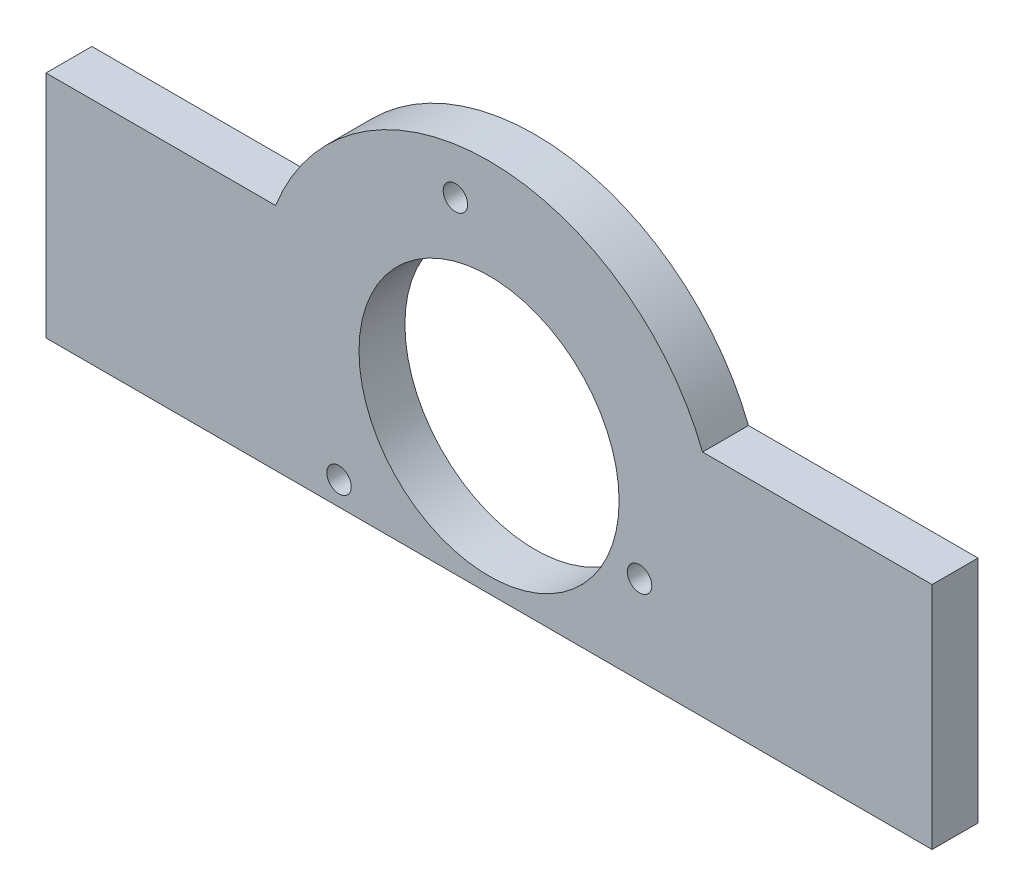
ISO-10303-21;
HEADER;
FILE_DESCRIPTION(('STEP AP214'),'2;1');
FILE_NAME('part.step','',(''),(''),'','','');
FILE_SCHEMA(('AUTOMOTIVE_DESIGN { 1 0 10303 214 1 1 1 1 }'));
ENDSEC;
DATA;
#1=APPLICATION_CONTEXT('core data for automotive mechanical design processes');
#2=APPLICATION_PROTOCOL_DEFINITION('international standard','automotive_design',2000,#1);
#3=PRODUCT_CONTEXT('',#1,'mechanical');
#4=PRODUCT('Part','Part','',(#3));
#5=PRODUCT_RELATED_PRODUCT_CATEGORY('part','',(#4));
#6=PRODUCT_DEFINITION_FORMATION('','',#4);
#7=PRODUCT_DEFINITION_CONTEXT('part definition',#1,'design');
#8=PRODUCT_DEFINITION('design','',#6,#7);
#9=PRODUCT_DEFINITION_SHAPE('','',#8);
#10=(LENGTH_UNIT() NAMED_UNIT(*) SI_UNIT(.MILLI.,.METRE.));
#11=(NAMED_UNIT(*) PLANE_ANGLE_UNIT() SI_UNIT($,.RADIAN.));
#12=(NAMED_UNIT(*) SI_UNIT($,.STERADIAN.) SOLID_ANGLE_UNIT());
#13=UNCERTAINTY_MEASURE_WITH_UNIT(LENGTH_MEASURE(1.E-05),#10,'distance_accuracy_value','');
#14=(GEOMETRIC_REPRESENTATION_CONTEXT(3) GLOBAL_UNCERTAINTY_ASSIGNED_CONTEXT((#13)) GLOBAL_UNIT_ASSIGNED_CONTEXT((#10,
#11,#12)) REPRESENTATION_CONTEXT('',''));
#15=CARTESIAN_POINT('',(0.,0.,0.));
#16=DIRECTION('',(0.,0.,1.));
#17=DIRECTION('',(1.,0.,0.));
#18=AXIS2_PLACEMENT_3D('',#15,#16,#17);
#19=CARTESIAN_POINT('',(0.,0.,7.62));
#20=DIRECTION('',(0.,0.,-1.));
#21=DIRECTION('',(-1.,0.,0.));
#22=AXIS2_PLACEMENT_3D('',#19,#20,#21);
#23=CYLINDRICAL_SURFACE('',#22,38.1);
#24=DIRECTION('',(0.,0.,-1.));
#25=VECTOR('',#24,1.);
#26=CARTESIAN_POINT('',(35.4464257718603,13.97,7.62));
#27=LINE('',#26,#25);
#28=CARTESIAN_POINT('',(35.4464257718603,13.97,7.62));
#29=VERTEX_POINT('',#28);
#30=CARTESIAN_POINT('',(35.4464257718603,13.97,0.));
#31=VERTEX_POINT('',#30);
#32=EDGE_CURVE('E50',#29,#31,#27,.T.);
#33=ORIENTED_EDGE('',*,*,#32,.T.);
#34=CARTESIAN_POINT('',(0.,0.,0.));
#35=DIRECTION('',(0.,0.,1.));
#36=DIRECTION('',(1.,0.,0.));
#37=AXIS2_PLACEMENT_3D('',#34,#35,#36);
#38=CIRCLE('',#37,38.1);
#39=CARTESIAN_POINT('',(-35.4464257718603,13.97,0.));
#40=VERTEX_POINT('',#39);
#41=EDGE_CURVE('E36',#31,#40,#38,.T.);
#42=ORIENTED_EDGE('',*,*,#41,.T.);
#43=DIRECTION('',(0.,0.,-1.));
#44=VECTOR('',#43,1.);
#45=CARTESIAN_POINT('',(-35.4464257718603,13.97,7.62));
#46=LINE('',#45,#44);
#47=CARTESIAN_POINT('',(-35.4464257718603,13.97,7.62));
#48=VERTEX_POINT('',#47);
#49=EDGE_CURVE('E130',#48,#40,#46,.T.);
#50=ORIENTED_EDGE('',*,*,#49,.F.);
#51=CARTESIAN_POINT('',(0.,0.,7.62));
#52=DIRECTION('',(0.,0.,1.));
#53=DIRECTION('',(1.,0.,0.));
#54=AXIS2_PLACEMENT_3D('',#51,#52,#53);
#55=CIRCLE('',#54,38.1);
#56=EDGE_CURVE('E11',#29,#48,#55,.T.);
#57=ORIENTED_EDGE('',*,*,#56,.F.);
#58=EDGE_LOOP('',(#33,#42,#50,#57));
#59=FACE_BOUND('',#58,.T.);
#60=ADVANCED_FACE('F33',(#59),#23,.T.);
#61=CARTESIAN_POINT('',(0.,0.,7.62));
#62=DIRECTION('',(0.,0.,1.));
#63=DIRECTION('',(1.,0.,0.));
#64=AXIS2_PLACEMENT_3D('',#61,#62,#63);
#65=PLANE('',#64);
#66=DIRECTION('',(-1.,0.,0.));
#67=VECTOR('',#66,1.);
#68=CARTESIAN_POINT('',(-36.2560555223226,-24.13,7.62));
#69=LINE('',#68,#67);
#70=CARTESIAN_POINT('',(73.5464257718603,-24.13,7.62));
#71=VERTEX_POINT('',#70);
#72=CARTESIAN_POINT('',(-73.5464257718603,-24.13,7.62));
#73=VERTEX_POINT('',#72);
#74=EDGE_CURVE('E81',#71,#73,#69,.T.);
#75=ORIENTED_EDGE('',*,*,#74,.F.);
#76=DIRECTION('',(0.,1.,0.));
#77=VECTOR('',#76,1.);
#78=CARTESIAN_POINT('',(73.5464257718603,0.,7.62));
#79=LINE('',#78,#77);
#80=CARTESIAN_POINT('',(73.5464257718603,13.97,7.62));
#81=VERTEX_POINT('',#80);
#82=EDGE_CURVE('E86',#71,#81,#79,.T.);
#83=ORIENTED_EDGE('',*,*,#82,.T.);
#84=DIRECTION('',(-1.,0.,0.));
#85=VECTOR('',#84,1.);
#86=CARTESIAN_POINT('',(0.,13.97,7.62));
#87=LINE('',#86,#85);
#88=EDGE_CURVE('E107',#81,#29,#87,.T.);
#89=ORIENTED_EDGE('',*,*,#88,.T.);
#90=ORIENTED_EDGE('',*,*,#56,.T.);
#91=DIRECTION('',(-1.,0.,0.));
#92=VECTOR('',#91,1.);
#93=CARTESIAN_POINT('',(0.,13.97,7.62));
#94=LINE('',#93,#92);
#95=CARTESIAN_POINT('',(-73.5464257718603,13.97,7.62));
#96=VERTEX_POINT('',#95);
#97=EDGE_CURVE('E118',#48,#96,#94,.T.);
#98=ORIENTED_EDGE('',*,*,#97,.T.);
#99=DIRECTION('',(0.,-1.,0.));
#100=VECTOR('',#99,1.);
#101=CARTESIAN_POINT('',(-73.5464257718603,0.,7.62));
#102=LINE('',#101,#100);
#103=EDGE_CURVE('E89',#96,#73,#102,.T.);
#104=ORIENTED_EDGE('',*,*,#103,.T.);
#105=EDGE_LOOP('',(#75,#83,#89,#90,#98,#104));
#106=FACE_BOUND('',#105,.T.);
#107=CARTESIAN_POINT('',(-24.9028298832855,-20.1910928657445,7.62));
#108=DIRECTION('',(0.,0.,1.));
#109=DIRECTION('',(1.,0.,0.));
#110=AXIS2_PLACEMENT_3D('',#107,#108,#109);
#111=CIRCLE('',#110,2.032);
#112=CARTESIAN_POINT('',(-22.8708298832855,-20.1910928657445,7.62));
#113=VERTEX_POINT('',#112);
#114=EDGE_CURVE('E136',#113,#113,#111,.T.);
#115=ORIENTED_EDGE('',*,*,#114,.F.);
#116=EDGE_LOOP('',(#115));
#117=FACE_BOUND('',#116,.T.);
#118=CARTESIAN_POINT('',(-5.58170556163229,30.0374071342555,7.62));
#119=DIRECTION('',(0.,0.,1.));
#120=DIRECTION('',(1.,0.,0.));
#121=AXIS2_PLACEMENT_3D('',#118,#119,#120);
#122=CIRCLE('',#121,2.032);
#123=CARTESIAN_POINT('',(-3.54970556163229,30.0374071342555,7.62));
#124=VERTEX_POINT('',#123);
#125=EDGE_CURVE('E142',#124,#124,#122,.T.);
#126=ORIENTED_EDGE('',*,*,#125,.F.);
#127=EDGE_LOOP('',(#126));
#128=FACE_BOUND('',#127,.T.);
#129=CARTESIAN_POINT('',(24.9827701167145,-9.48466626464084,7.62));
#130=DIRECTION('',(0.,0.,1.));
#131=DIRECTION('',(1.,0.,0.));
#132=AXIS2_PLACEMENT_3D('',#129,#130,#131);
#133=CIRCLE('',#132,2.032);
#134=CARTESIAN_POINT('',(27.0147701167145,-9.48466626464084,7.62));
#135=VERTEX_POINT('',#134);
#136=EDGE_CURVE('E133',#135,#135,#133,.T.);
#137=ORIENTED_EDGE('',*,*,#136,.F.);
#138=EDGE_LOOP('',(#137));
#139=FACE_BOUND('',#138,.T.);
#140=CARTESIAN_POINT('',(0.,0.,7.62));
#141=DIRECTION('',(0.,0.,1.));
#142=DIRECTION('',(1.,0.,0.));
#143=AXIS2_PLACEMENT_3D('',#140,#141,#142);
#144=CIRCLE('',#143,21.59);
#145=CARTESIAN_POINT('',(-21.59,0.,7.62));
#146=VERTEX_POINT('',#145);
#147=EDGE_CURVE('E152',#146,#146,#144,.T.);
#148=ORIENTED_EDGE('',*,*,#147,.F.);
#149=EDGE_LOOP('',(#148));
#150=FACE_BOUND('',#149,.T.);
#151=ADVANCED_FACE('F83',(#106,#117,#128,#139,#150),#65,.T.);
#152=CARTESIAN_POINT('',(0.,0.,0.));
#153=DIRECTION('',(0.,0.,1.));
#154=DIRECTION('',(1.,0.,0.));
#155=AXIS2_PLACEMENT_3D('',#152,#153,#154);
#156=PLANE('',#155);
#157=ORIENTED_EDGE('',*,*,#41,.F.);
#158=DIRECTION('',(-1.,0.,0.));
#159=VECTOR('',#158,1.);
#160=CARTESIAN_POINT('',(0.,13.97,0.));
#161=LINE('',#160,#159);
#162=CARTESIAN_POINT('',(73.5464257718603,13.97,0.));
#163=VERTEX_POINT('',#162);
#164=EDGE_CURVE('E108',#163,#31,#161,.T.);
#165=ORIENTED_EDGE('',*,*,#164,.F.);
#166=DIRECTION('',(0.,1.,0.));
#167=VECTOR('',#166,1.);
#168=CARTESIAN_POINT('',(73.5464257718603,0.,0.));
#169=LINE('',#168,#167);
#170=CARTESIAN_POINT('',(73.5464257718603,-24.13,0.));
#171=VERTEX_POINT('',#170);
#172=EDGE_CURVE('E112',#171,#163,#169,.T.);
#173=ORIENTED_EDGE('',*,*,#172,.F.);
#174=DIRECTION('',(-1.,0.,0.));
#175=VECTOR('',#174,1.);
#176=CARTESIAN_POINT('',(-36.2560555223226,-24.13,0.));
#177=LINE('',#176,#175);
#178=CARTESIAN_POINT('',(-73.5464257718603,-24.13,0.));
#179=VERTEX_POINT('',#178);
#180=EDGE_CURVE('E93',#171,#179,#177,.T.);
#181=ORIENTED_EDGE('',*,*,#180,.T.);
#182=DIRECTION('',(0.,-1.,0.));
#183=VECTOR('',#182,1.);
#184=CARTESIAN_POINT('',(-73.5464257718603,0.,0.));
#185=LINE('',#184,#183);
#186=CARTESIAN_POINT('',(-73.5464257718603,13.97,0.));
#187=VERTEX_POINT('',#186);
#188=EDGE_CURVE('E120',#187,#179,#185,.T.);
#189=ORIENTED_EDGE('',*,*,#188,.F.);
#190=DIRECTION('',(-1.,0.,0.));
#191=VECTOR('',#190,1.);
#192=CARTESIAN_POINT('',(0.,13.97,0.));
#193=LINE('',#192,#191);
#194=EDGE_CURVE('E101',#40,#187,#193,.T.);
#195=ORIENTED_EDGE('',*,*,#194,.F.);
#196=EDGE_LOOP('',(#157,#165,#173,#181,#189,#195));
#197=FACE_BOUND('',#196,.T.);
#198=CARTESIAN_POINT('',(-24.9028298832855,-20.1910928657445,0.));
#199=DIRECTION('',(0.,0.,1.));
#200=DIRECTION('',(1.,0.,0.));
#201=AXIS2_PLACEMENT_3D('',#198,#199,#200);
#202=CIRCLE('',#201,2.032);
#203=CARTESIAN_POINT('',(-22.8708298832855,-20.1910928657445,0.));
#204=VERTEX_POINT('',#203);
#205=EDGE_CURVE('E94',#204,#204,#202,.T.);
#206=ORIENTED_EDGE('',*,*,#205,.T.);
#207=EDGE_LOOP('',(#206));
#208=FACE_BOUND('',#207,.T.);
#209=CARTESIAN_POINT('',(-5.58170556163229,30.0374071342555,0.));
#210=DIRECTION('',(0.,0.,1.));
#211=DIRECTION('',(1.,0.,0.));
#212=AXIS2_PLACEMENT_3D('',#209,#210,#211);
#213=CIRCLE('',#212,2.032);
#214=CARTESIAN_POINT('',(-3.54970556163229,30.0374071342555,0.));
#215=VERTEX_POINT('',#214);
#216=EDGE_CURVE('E139',#215,#215,#213,.T.);
#217=ORIENTED_EDGE('',*,*,#216,.T.);
#218=EDGE_LOOP('',(#217));
#219=FACE_BOUND('',#218,.T.);
#220=CARTESIAN_POINT('',(24.9827701167145,-9.48466626464084,0.));
#221=DIRECTION('',(0.,0.,1.));
#222=DIRECTION('',(1.,0.,0.));
#223=AXIS2_PLACEMENT_3D('',#220,#221,#222);
#224=CIRCLE('',#223,2.032);
#225=CARTESIAN_POINT('',(27.0147701167145,-9.48466626464084,0.));
#226=VERTEX_POINT('',#225);
#227=EDGE_CURVE('E145',#226,#226,#224,.T.);
#228=ORIENTED_EDGE('',*,*,#227,.T.);
#229=EDGE_LOOP('',(#228));
#230=FACE_BOUND('',#229,.T.);
#231=CARTESIAN_POINT('',(0.,0.,0.));
#232=DIRECTION('',(0.,0.,1.));
#233=DIRECTION('',(1.,0.,0.));
#234=AXIS2_PLACEMENT_3D('',#231,#232,#233);
#235=CIRCLE('',#234,21.59);
#236=CARTESIAN_POINT('',(-21.59,0.,0.));
#237=VERTEX_POINT('',#236);
#238=EDGE_CURVE('E150',#237,#237,#235,.T.);
#239=ORIENTED_EDGE('',*,*,#238,.T.);
#240=EDGE_LOOP('',(#239));
#241=FACE_BOUND('',#240,.T.);
#242=ADVANCED_FACE('F158',(#197,#208,#219,#230,#241),#156,.F.);
#243=CARTESIAN_POINT('',(0.,0.,7.62));
#244=DIRECTION('',(0.,0.,-1.));
#245=DIRECTION('',(-1.,0.,0.));
#246=AXIS2_PLACEMENT_3D('',#243,#244,#245);
#247=CYLINDRICAL_SURFACE('',#246,21.59);
#248=CARTESIAN_POINT('',(-21.59,0.,7.62));
#249=CARTESIAN_POINT('',(-21.59,0.,7.540625));
#250=CARTESIAN_POINT('',(-21.59,0.,7.46125));
#251=CARTESIAN_POINT('',(-21.59,0.,7.3025));
#252=CARTESIAN_POINT('',(-21.59,0.,7.223125));
#253=CARTESIAN_POINT('',(-21.59,0.,7.064375));
#254=CARTESIAN_POINT('',(-21.59,0.,6.985));
#255=CARTESIAN_POINT('',(-21.59,0.,6.82625));
#256=CARTESIAN_POINT('',(-21.59,0.,6.746875));
#257=CARTESIAN_POINT('',(-21.59,0.,6.588125));
#258=CARTESIAN_POINT('',(-21.59,0.,6.50875));
#259=CARTESIAN_POINT('',(-21.59,0.,6.35));
#260=CARTESIAN_POINT('',(-21.59,0.,6.270625));
#261=CARTESIAN_POINT('',(-21.59,0.,6.111875));
#262=CARTESIAN_POINT('',(-21.59,0.,6.0325));
#263=CARTESIAN_POINT('',(-21.59,0.,5.87375));
#264=CARTESIAN_POINT('',(-21.59,0.,5.794375));
#265=CARTESIAN_POINT('',(-21.59,0.,5.635625));
#266=CARTESIAN_POINT('',(-21.59,0.,5.55625));
#267=CARTESIAN_POINT('',(-21.59,0.,5.3975));
#268=CARTESIAN_POINT('',(-21.59,0.,5.318125));
#269=CARTESIAN_POINT('',(-21.59,0.,5.159375));
#270=CARTESIAN_POINT('',(-21.59,0.,5.08));
#271=CARTESIAN_POINT('',(-21.59,0.,4.92125));
#272=CARTESIAN_POINT('',(-21.59,0.,4.841875));
#273=CARTESIAN_POINT('',(-21.59,0.,4.683125));
#274=CARTESIAN_POINT('',(-21.59,0.,4.60375));
#275=CARTESIAN_POINT('',(-21.59,0.,4.445));
#276=CARTESIAN_POINT('',(-21.59,0.,4.365625));
#277=CARTESIAN_POINT('',(-21.59,0.,4.206875));
#278=CARTESIAN_POINT('',(-21.59,0.,4.1275));
#279=CARTESIAN_POINT('',(-21.59,0.,3.96875));
#280=CARTESIAN_POINT('',(-21.59,0.,3.889375));
#281=CARTESIAN_POINT('',(-21.59,0.,3.730625));
#282=CARTESIAN_POINT('',(-21.59,0.,3.65125));
#283=CARTESIAN_POINT('',(-21.59,0.,3.4925));
#284=CARTESIAN_POINT('',(-21.59,0.,3.413125));
#285=CARTESIAN_POINT('',(-21.59,0.,3.254375));
#286=CARTESIAN_POINT('',(-21.59,0.,3.175));
#287=CARTESIAN_POINT('',(-21.59,0.,3.01625));
#288=CARTESIAN_POINT('',(-21.59,0.,2.936875));
#289=CARTESIAN_POINT('',(-21.59,0.,2.778125));
#290=CARTESIAN_POINT('',(-21.59,0.,2.69875));
#291=CARTESIAN_POINT('',(-21.59,0.,2.54));
#292=CARTESIAN_POINT('',(-21.59,0.,2.460625));
#293=CARTESIAN_POINT('',(-21.59,0.,2.301875));
#294=CARTESIAN_POINT('',(-21.59,0.,2.2225));
#295=CARTESIAN_POINT('',(-21.59,0.,2.06375));
#296=CARTESIAN_POINT('',(-21.59,0.,1.984375));
#297=CARTESIAN_POINT('',(-21.59,0.,1.825625));
#298=CARTESIAN_POINT('',(-21.59,0.,1.74625));
#299=CARTESIAN_POINT('',(-21.59,0.,1.5875));
#300=CARTESIAN_POINT('',(-21.59,0.,1.508125));
#301=CARTESIAN_POINT('',(-21.59,0.,1.349375));
#302=CARTESIAN_POINT('',(-21.59,0.,1.27));
#303=CARTESIAN_POINT('',(-21.59,0.,1.11125));
#304=CARTESIAN_POINT('',(-21.59,0.,1.031875));
#305=CARTESIAN_POINT('',(-21.59,0.,0.873125));
#306=CARTESIAN_POINT('',(-21.59,0.,0.79375));
#307=CARTESIAN_POINT('',(-21.59,0.,0.635));
#308=CARTESIAN_POINT('',(-21.59,0.,0.555625));
#309=CARTESIAN_POINT('',(-21.59,0.,0.396875));
#310=CARTESIAN_POINT('',(-21.59,0.,0.3175));
#311=CARTESIAN_POINT('',(-21.59,0.,0.15875));
#312=CARTESIAN_POINT('',(-21.59,0.,0.0793749999999999));
#313=CARTESIAN_POINT('',(-21.59,0.,0.));
#314=B_SPLINE_CURVE_WITH_KNOTS('',3,(#248,#249,#250,#251,#252,#253,#254,#255,#256,#257,#258,
#259,#260,#261,#262,#263,#264,#265,#266,#267,#268,#269,#270,#271,#272,#273,#274,#275,#276,#277,
#278,#279,#280,#281,#282,#283,#284,#285,#286,#287,#288,#289,#290,#291,#292,#293,#294,#295,#296,
#297,#298,#299,#300,#301,#302,#303,#304,#305,#306,#307,#308,#309,#310,#311,#312,#313),
.UNSPECIFIED.,.F.,.F.,(4,2,2,2,2,2,2,2,2,2,2,2,2,2,2,2,2,2,2,2,2,2,2,2,2,2,2,2,2,2,2,2,4),(0.,
0.238125,0.476249999999999,0.714375,0.952499999999999,1.190625,1.42875,1.666875,1.905,2.143125,
2.38125,2.619375,2.8575,3.095625,3.33375,3.571875,3.81,4.048125,4.28625,4.524375,4.7625,
5.000625,5.23875,5.476875,5.715,5.953125,6.19125,6.429375,6.6675,6.905625,7.14375,7.381875,
7.62),.UNSPECIFIED.);
#315=EDGE_CURVE('BSEAM160',#146,#237,#314,.T.);
#316=ORIENTED_EDGE('',*,*,#147,.T.);
#317=ORIENTED_EDGE('',*,*,#238,.F.);
#318=ORIENTED_EDGE('',*,*,#315,.T.);
#319=ORIENTED_EDGE('',*,*,#315,.F.);
#320=EDGE_LOOP('',(#316,#318,#317,#319));
#321=FACE_BOUND('',#320,.T.);
#322=ADVANCED_FACE('F160',(#321),#247,.F.);
#323=CARTESIAN_POINT('',(-36.2560555223226,-24.13,0.));
#324=DIRECTION('',(0.,1.,0.));
#325=DIRECTION('',(0.,0.,1.));
#326=AXIS2_PLACEMENT_3D('',#323,#324,#325);
#327=PLANE('',#326);
#328=ORIENTED_EDGE('',*,*,#74,.T.);
#329=DIRECTION('',(0.,0.,-1.));
#330=VECTOR('',#329,1.);
#331=CARTESIAN_POINT('',(-73.5464257718603,-24.13,7.62));
#332=LINE('',#331,#330);
#333=EDGE_CURVE('E122',#73,#179,#332,.T.);
#334=ORIENTED_EDGE('',*,*,#333,.T.);
#335=ORIENTED_EDGE('',*,*,#180,.F.);
#336=DIRECTION('',(0.,0.,-1.));
#337=VECTOR('',#336,1.);
#338=CARTESIAN_POINT('',(73.5464257718603,-24.13,7.62));
#339=LINE('',#338,#337);
#340=EDGE_CURVE('E97',#71,#171,#339,.T.);
#341=ORIENTED_EDGE('',*,*,#340,.F.);
#342=EDGE_LOOP('',(#328,#334,#335,#341));
#343=FACE_BOUND('',#342,.T.);
#344=ADVANCED_FACE('F98',(#343),#327,.F.);
#345=CARTESIAN_POINT('',(24.9827701167145,-9.48466626464084,0.));
#346=DIRECTION('',(0.,0.,1.));
#347=DIRECTION('',(1.,0.,0.));
#348=AXIS2_PLACEMENT_3D('',#345,#346,#347);
#349=CYLINDRICAL_SURFACE('',#348,2.032);
#350=CARTESIAN_POINT('',(27.0147701167145,-9.48466626464084,0.));
#351=CARTESIAN_POINT('',(27.0147701167145,-9.48466626464084,0.0793749999999998));
#352=CARTESIAN_POINT('',(27.0147701167145,-9.48466626464084,0.15875));
#353=CARTESIAN_POINT('',(27.0147701167145,-9.48466626464084,0.3175));
#354=CARTESIAN_POINT('',(27.0147701167145,-9.48466626464084,0.396875));
#355=CARTESIAN_POINT('',(27.0147701167145,-9.48466626464084,0.555625));
#356=CARTESIAN_POINT('',(27.0147701167145,-9.48466626464084,0.635));
#357=CARTESIAN_POINT('',(27.0147701167145,-9.48466626464084,0.79375));
#358=CARTESIAN_POINT('',(27.0147701167145,-9.48466626464084,0.873125));
#359=CARTESIAN_POINT('',(27.0147701167145,-9.48466626464084,1.031875));
#360=CARTESIAN_POINT('',(27.0147701167145,-9.48466626464084,1.11125));
#361=CARTESIAN_POINT('',(27.0147701167145,-9.48466626464084,1.27));
#362=CARTESIAN_POINT('',(27.0147701167145,-9.48466626464084,1.349375));
#363=CARTESIAN_POINT('',(27.0147701167145,-9.48466626464084,1.508125));
#364=CARTESIAN_POINT('',(27.0147701167145,-9.48466626464084,1.5875));
#365=CARTESIAN_POINT('',(27.0147701167145,-9.48466626464084,1.74625));
#366=CARTESIAN_POINT('',(27.0147701167145,-9.48466626464084,1.825625));
#367=CARTESIAN_POINT('',(27.0147701167145,-9.48466626464084,1.984375));
#368=CARTESIAN_POINT('',(27.0147701167145,-9.48466626464084,2.06375));
#369=CARTESIAN_POINT('',(27.0147701167145,-9.48466626464084,2.2225));
#370=CARTESIAN_POINT('',(27.0147701167145,-9.48466626464084,2.301875));
#371=CARTESIAN_POINT('',(27.0147701167145,-9.48466626464084,2.460625));
#372=CARTESIAN_POINT('',(27.0147701167145,-9.48466626464084,2.54));
#373=CARTESIAN_POINT('',(27.0147701167145,-9.48466626464084,2.69875));
#374=CARTESIAN_POINT('',(27.0147701167145,-9.48466626464084,2.778125));
#375=CARTESIAN_POINT('',(27.0147701167145,-9.48466626464084,2.936875));
#376=CARTESIAN_POINT('',(27.0147701167145,-9.48466626464084,3.01625));
#377=CARTESIAN_POINT('',(27.0147701167145,-9.48466626464084,3.175));
#378=CARTESIAN_POINT('',(27.0147701167145,-9.48466626464084,3.254375));
#379=CARTESIAN_POINT('',(27.0147701167145,-9.48466626464084,3.413125));
#380=CARTESIAN_POINT('',(27.0147701167145,-9.48466626464084,3.4925));
#381=CARTESIAN_POINT('',(27.0147701167145,-9.48466626464084,3.65125));
#382=CARTESIAN_POINT('',(27.0147701167145,-9.48466626464084,3.730625));
#383=CARTESIAN_POINT('',(27.0147701167145,-9.48466626464084,3.889375));
#384=CARTESIAN_POINT('',(27.0147701167145,-9.48466626464084,3.96875));
#385=CARTESIAN_POINT('',(27.0147701167145,-9.48466626464084,4.1275));
#386=CARTESIAN_POINT('',(27.0147701167145,-9.48466626464084,4.206875));
#387=CARTESIAN_POINT('',(27.0147701167145,-9.48466626464084,4.365625));
#388=CARTESIAN_POINT('',(27.0147701167145,-9.48466626464084,4.445));
#389=CARTESIAN_POINT('',(27.0147701167145,-9.48466626464084,4.60375));
#390=CARTESIAN_POINT('',(27.0147701167145,-9.48466626464084,4.683125));
#391=CARTESIAN_POINT('',(27.0147701167145,-9.48466626464084,4.841875));
#392=CARTESIAN_POINT('',(27.0147701167145,-9.48466626464084,4.92125));
#393=CARTESIAN_POINT('',(27.0147701167145,-9.48466626464084,5.08));
#394=CARTESIAN_POINT('',(27.0147701167145,-9.48466626464084,5.159375));
#395=CARTESIAN_POINT('',(27.0147701167145,-9.48466626464084,5.318125));
#396=CARTESIAN_POINT('',(27.0147701167145,-9.48466626464084,5.3975));
#397=CARTESIAN_POINT('',(27.0147701167145,-9.48466626464084,5.55625));
#398=CARTESIAN_POINT('',(27.0147701167145,-9.48466626464084,5.635625));
#399=CARTESIAN_POINT('',(27.0147701167145,-9.48466626464084,5.794375));
#400=CARTESIAN_POINT('',(27.0147701167145,-9.48466626464084,5.87375));
#401=CARTESIAN_POINT('',(27.0147701167145,-9.48466626464084,6.0325));
#402=CARTESIAN_POINT('',(27.0147701167145,-9.48466626464084,6.111875));
#403=CARTESIAN_POINT('',(27.0147701167145,-9.48466626464084,6.270625));
#404=CARTESIAN_POINT('',(27.0147701167145,-9.48466626464084,6.35));
#405=CARTESIAN_POINT('',(27.0147701167145,-9.48466626464084,6.50875));
#406=CARTESIAN_POINT('',(27.0147701167145,-9.48466626464084,6.588125));
#407=CARTESIAN_POINT('',(27.0147701167145,-9.48466626464084,6.746875));
#408=CARTESIAN_POINT('',(27.0147701167145,-9.48466626464084,6.82625));
#409=CARTESIAN_POINT('',(27.0147701167145,-9.48466626464084,6.985));
#410=CARTESIAN_POINT('',(27.0147701167145,-9.48466626464084,7.064375));
#411=CARTESIAN_POINT('',(27.0147701167145,-9.48466626464084,7.223125));
#412=CARTESIAN_POINT('',(27.0147701167145,-9.48466626464084,7.3025));
#413=CARTESIAN_POINT('',(27.0147701167145,-9.48466626464084,7.46125));
#414=CARTESIAN_POINT('',(27.0147701167145,-9.48466626464084,7.540625));
#415=CARTESIAN_POINT('',(27.0147701167145,-9.48466626464084,7.62));
#416=B_SPLINE_CURVE_WITH_KNOTS('',3,(#350,#351,#352,#353,#354,#355,#356,#357,#358,#359,#360,
#361,#362,#363,#364,#365,#366,#367,#368,#369,#370,#371,#372,#373,#374,#375,#376,#377,#378,#379,
#380,#381,#382,#383,#384,#385,#386,#387,#388,#389,#390,#391,#392,#393,#394,#395,#396,#397,#398,
#399,#400,#401,#402,#403,#404,#405,#406,#407,#408,#409,#410,#411,#412,#413,#414,#415),
.UNSPECIFIED.,.F.,.F.,(4,2,2,2,2,2,2,2,2,2,2,2,2,2,2,2,2,2,2,2,2,2,2,2,2,2,2,2,2,2,2,2,4),(0.,
0.238125,0.47625,0.714375,0.9525,1.190625,1.42875,1.666875,1.905,2.143125,2.38125,2.619375,
2.8575,3.095625,3.33375,3.571875,3.81,4.048125,4.28625,4.524375,4.7625,5.000625,5.23875,
5.476875,5.715,5.953125,6.19125,6.429375,6.6675,6.905625,7.14375,7.381875,7.62),.UNSPECIFIED.);
#417=EDGE_CURVE('BSEAM168',#226,#135,#416,.T.);
#418=ORIENTED_EDGE('',*,*,#227,.F.);
#419=ORIENTED_EDGE('',*,*,#136,.T.);
#420=ORIENTED_EDGE('',*,*,#417,.T.);
#421=ORIENTED_EDGE('',*,*,#417,.F.);
#422=EDGE_LOOP('',(#418,#420,#419,#421));
#423=FACE_BOUND('',#422,.T.);
#424=ADVANCED_FACE('F168',(#423),#349,.F.);
#425=CARTESIAN_POINT('',(-5.58170556163229,30.0374071342555,0.));
#426=DIRECTION('',(0.,0.,1.));
#427=DIRECTION('',(1.,0.,0.));
#428=AXIS2_PLACEMENT_3D('',#425,#426,#427);
#429=CYLINDRICAL_SURFACE('',#428,2.032);
#430=CARTESIAN_POINT('',(-3.54970556163229,30.0374071342555,0.));
#431=CARTESIAN_POINT('',(-3.54970556163229,30.0374071342555,0.0793749999999998));
#432=CARTESIAN_POINT('',(-3.54970556163229,30.0374071342555,0.15875));
#433=CARTESIAN_POINT('',(-3.54970556163229,30.0374071342555,0.3175));
#434=CARTESIAN_POINT('',(-3.54970556163229,30.0374071342555,0.396875));
#435=CARTESIAN_POINT('',(-3.54970556163229,30.0374071342555,0.555625));
#436=CARTESIAN_POINT('',(-3.54970556163229,30.0374071342555,0.635));
#437=CARTESIAN_POINT('',(-3.54970556163229,30.0374071342555,0.79375));
#438=CARTESIAN_POINT('',(-3.54970556163229,30.0374071342555,0.873125));
#439=CARTESIAN_POINT('',(-3.54970556163229,30.0374071342555,1.031875));
#440=CARTESIAN_POINT('',(-3.54970556163229,30.0374071342555,1.11125));
#441=CARTESIAN_POINT('',(-3.54970556163229,30.0374071342555,1.27));
#442=CARTESIAN_POINT('',(-3.54970556163229,30.0374071342555,1.349375));
#443=CARTESIAN_POINT('',(-3.54970556163229,30.0374071342555,1.508125));
#444=CARTESIAN_POINT('',(-3.54970556163229,30.0374071342555,1.5875));
#445=CARTESIAN_POINT('',(-3.54970556163229,30.0374071342555,1.74625));
#446=CARTESIAN_POINT('',(-3.54970556163229,30.0374071342555,1.825625));
#447=CARTESIAN_POINT('',(-3.54970556163229,30.0374071342555,1.984375));
#448=CARTESIAN_POINT('',(-3.54970556163229,30.0374071342555,2.06375));
#449=CARTESIAN_POINT('',(-3.54970556163229,30.0374071342555,2.2225));
#450=CARTESIAN_POINT('',(-3.54970556163229,30.0374071342555,2.301875));
#451=CARTESIAN_POINT('',(-3.54970556163229,30.0374071342555,2.460625));
#452=CARTESIAN_POINT('',(-3.54970556163229,30.0374071342555,2.54));
#453=CARTESIAN_POINT('',(-3.54970556163229,30.0374071342555,2.69875));
#454=CARTESIAN_POINT('',(-3.54970556163229,30.0374071342555,2.778125));
#455=CARTESIAN_POINT('',(-3.54970556163229,30.0374071342555,2.936875));
#456=CARTESIAN_POINT('',(-3.54970556163229,30.0374071342555,3.01625));
#457=CARTESIAN_POINT('',(-3.54970556163229,30.0374071342555,3.175));
#458=CARTESIAN_POINT('',(-3.54970556163229,30.0374071342555,3.254375));
#459=CARTESIAN_POINT('',(-3.54970556163229,30.0374071342555,3.413125));
#460=CARTESIAN_POINT('',(-3.54970556163229,30.0374071342555,3.4925));
#461=CARTESIAN_POINT('',(-3.54970556163229,30.0374071342555,3.65125));
#462=CARTESIAN_POINT('',(-3.54970556163229,30.0374071342555,3.730625));
#463=CARTESIAN_POINT('',(-3.54970556163229,30.0374071342555,3.889375));
#464=CARTESIAN_POINT('',(-3.54970556163229,30.0374071342555,3.96875));
#465=CARTESIAN_POINT('',(-3.54970556163229,30.0374071342555,4.1275));
#466=CARTESIAN_POINT('',(-3.54970556163229,30.0374071342555,4.206875));
#467=CARTESIAN_POINT('',(-3.54970556163229,30.0374071342555,4.365625));
#468=CARTESIAN_POINT('',(-3.54970556163229,30.0374071342555,4.445));
#469=CARTESIAN_POINT('',(-3.54970556163229,30.0374071342555,4.60375));
#470=CARTESIAN_POINT('',(-3.54970556163229,30.0374071342555,4.683125));
#471=CARTESIAN_POINT('',(-3.54970556163229,30.0374071342555,4.841875));
#472=CARTESIAN_POINT('',(-3.54970556163229,30.0374071342555,4.92125));
#473=CARTESIAN_POINT('',(-3.54970556163229,30.0374071342555,5.08));
#474=CARTESIAN_POINT('',(-3.54970556163229,30.0374071342555,5.159375));
#475=CARTESIAN_POINT('',(-3.54970556163229,30.0374071342555,5.318125));
#476=CARTESIAN_POINT('',(-3.54970556163229,30.0374071342555,5.3975));
#477=CARTESIAN_POINT('',(-3.54970556163229,30.0374071342555,5.55625));
#478=CARTESIAN_POINT('',(-3.54970556163229,30.0374071342555,5.635625));
#479=CARTESIAN_POINT('',(-3.54970556163229,30.0374071342555,5.794375));
#480=CARTESIAN_POINT('',(-3.54970556163229,30.0374071342555,5.87375));
#481=CARTESIAN_POINT('',(-3.54970556163229,30.0374071342555,6.0325));
#482=CARTESIAN_POINT('',(-3.54970556163229,30.0374071342555,6.111875));
#483=CARTESIAN_POINT('',(-3.54970556163229,30.0374071342555,6.270625));
#484=CARTESIAN_POINT('',(-3.54970556163229,30.0374071342555,6.35));
#485=CARTESIAN_POINT('',(-3.54970556163229,30.0374071342555,6.50875));
#486=CARTESIAN_POINT('',(-3.54970556163229,30.0374071342555,6.588125));
#487=CARTESIAN_POINT('',(-3.54970556163229,30.0374071342555,6.746875));
#488=CARTESIAN_POINT('',(-3.54970556163229,30.0374071342555,6.82625));
#489=CARTESIAN_POINT('',(-3.54970556163229,30.0374071342555,6.985));
#490=CARTESIAN_POINT('',(-3.54970556163229,30.0374071342555,7.064375));
#491=CARTESIAN_POINT('',(-3.54970556163229,30.0374071342555,7.223125));
#492=CARTESIAN_POINT('',(-3.54970556163229,30.0374071342555,7.3025));
#493=CARTESIAN_POINT('',(-3.54970556163229,30.0374071342555,7.46125));
#494=CARTESIAN_POINT('',(-3.54970556163229,30.0374071342555,7.540625));
#495=CARTESIAN_POINT('',(-3.54970556163229,30.0374071342555,7.62));
#496=B_SPLINE_CURVE_WITH_KNOTS('',3,(#430,#431,#432,#433,#434,#435,#436,#437,#438,#439,#440,
#441,#442,#443,#444,#445,#446,#447,#448,#449,#450,#451,#452,#453,#454,#455,#456,#457,#458,#459,
#460,#461,#462,#463,#464,#465,#466,#467,#468,#469,#470,#471,#472,#473,#474,#475,#476,#477,#478,
#479,#480,#481,#482,#483,#484,#485,#486,#487,#488,#489,#490,#491,#492,#493,#494,#495),
.UNSPECIFIED.,.F.,.F.,(4,2,2,2,2,2,2,2,2,2,2,2,2,2,2,2,2,2,2,2,2,2,2,2,2,2,2,2,2,2,2,2,4),(0.,
0.238125,0.47625,0.714375,0.9525,1.190625,1.42875,1.666875,1.905,2.143125,2.38125,2.619375,
2.8575,3.095625,3.33375,3.571875,3.81,4.048125,4.28625,4.524375,4.7625,5.000625,5.23875,
5.476875,5.715,5.953125,6.19125,6.429375,6.6675,6.905625,7.14375,7.381875,7.62),.UNSPECIFIED.);
#497=EDGE_CURVE('BSEAM237',#215,#124,#496,.T.);
#498=ORIENTED_EDGE('',*,*,#216,.F.);
#499=ORIENTED_EDGE('',*,*,#125,.T.);
#500=ORIENTED_EDGE('',*,*,#497,.T.);
#501=ORIENTED_EDGE('',*,*,#497,.F.);
#502=EDGE_LOOP('',(#498,#500,#499,#501));
#503=FACE_BOUND('',#502,.T.);
#504=ADVANCED_FACE('F237',(#503),#429,.F.);
#505=CARTESIAN_POINT('',(-24.9028298832855,-20.1910928657445,0.));
#506=DIRECTION('',(0.,0.,1.));
#507=DIRECTION('',(1.,0.,0.));
#508=AXIS2_PLACEMENT_3D('',#505,#506,#507);
#509=CYLINDRICAL_SURFACE('',#508,2.032);
#510=CARTESIAN_POINT('',(-22.8708298832855,-20.1910928657445,0.));
#511=CARTESIAN_POINT('',(-22.8708298832855,-20.1910928657445,0.0793749999999998));
#512=CARTESIAN_POINT('',(-22.8708298832855,-20.1910928657445,0.15875));
#513=CARTESIAN_POINT('',(-22.8708298832855,-20.1910928657445,0.3175));
#514=CARTESIAN_POINT('',(-22.8708298832855,-20.1910928657445,0.396875));
#515=CARTESIAN_POINT('',(-22.8708298832855,-20.1910928657445,0.555625));
#516=CARTESIAN_POINT('',(-22.8708298832855,-20.1910928657445,0.635));
#517=CARTESIAN_POINT('',(-22.8708298832855,-20.1910928657445,0.79375));
#518=CARTESIAN_POINT('',(-22.8708298832855,-20.1910928657445,0.873125));
#519=CARTESIAN_POINT('',(-22.8708298832855,-20.1910928657445,1.031875));
#520=CARTESIAN_POINT('',(-22.8708298832855,-20.1910928657445,1.11125));
#521=CARTESIAN_POINT('',(-22.8708298832855,-20.1910928657445,1.27));
#522=CARTESIAN_POINT('',(-22.8708298832855,-20.1910928657445,1.349375));
#523=CARTESIAN_POINT('',(-22.8708298832855,-20.1910928657445,1.508125));
#524=CARTESIAN_POINT('',(-22.8708298832855,-20.1910928657445,1.5875));
#525=CARTESIAN_POINT('',(-22.8708298832855,-20.1910928657445,1.74625));
#526=CARTESIAN_POINT('',(-22.8708298832855,-20.1910928657445,1.825625));
#527=CARTESIAN_POINT('',(-22.8708298832855,-20.1910928657445,1.984375));
#528=CARTESIAN_POINT('',(-22.8708298832855,-20.1910928657445,2.06375));
#529=CARTESIAN_POINT('',(-22.8708298832855,-20.1910928657445,2.2225));
#530=CARTESIAN_POINT('',(-22.8708298832855,-20.1910928657445,2.301875));
#531=CARTESIAN_POINT('',(-22.8708298832855,-20.1910928657445,2.460625));
#532=CARTESIAN_POINT('',(-22.8708298832855,-20.1910928657445,2.54));
#533=CARTESIAN_POINT('',(-22.8708298832855,-20.1910928657445,2.69875));
#534=CARTESIAN_POINT('',(-22.8708298832855,-20.1910928657445,2.778125));
#535=CARTESIAN_POINT('',(-22.8708298832855,-20.1910928657445,2.936875));
#536=CARTESIAN_POINT('',(-22.8708298832855,-20.1910928657445,3.01625));
#537=CARTESIAN_POINT('',(-22.8708298832855,-20.1910928657445,3.175));
#538=CARTESIAN_POINT('',(-22.8708298832855,-20.1910928657445,3.254375));
#539=CARTESIAN_POINT('',(-22.8708298832855,-20.1910928657445,3.413125));
#540=CARTESIAN_POINT('',(-22.8708298832855,-20.1910928657445,3.4925));
#541=CARTESIAN_POINT('',(-22.8708298832855,-20.1910928657445,3.65125));
#542=CARTESIAN_POINT('',(-22.8708298832855,-20.1910928657445,3.730625));
#543=CARTESIAN_POINT('',(-22.8708298832855,-20.1910928657445,3.889375));
#544=CARTESIAN_POINT('',(-22.8708298832855,-20.1910928657445,3.96875));
#545=CARTESIAN_POINT('',(-22.8708298832855,-20.1910928657445,4.1275));
#546=CARTESIAN_POINT('',(-22.8708298832855,-20.1910928657445,4.206875));
#547=CARTESIAN_POINT('',(-22.8708298832855,-20.1910928657445,4.365625));
#548=CARTESIAN_POINT('',(-22.8708298832855,-20.1910928657445,4.445));
#549=CARTESIAN_POINT('',(-22.8708298832855,-20.1910928657445,4.60375));
#550=CARTESIAN_POINT('',(-22.8708298832855,-20.1910928657445,4.683125));
#551=CARTESIAN_POINT('',(-22.8708298832855,-20.1910928657445,4.841875));
#552=CARTESIAN_POINT('',(-22.8708298832855,-20.1910928657445,4.92125));
#553=CARTESIAN_POINT('',(-22.8708298832855,-20.1910928657445,5.08));
#554=CARTESIAN_POINT('',(-22.8708298832855,-20.1910928657445,5.159375));
#555=CARTESIAN_POINT('',(-22.8708298832855,-20.1910928657445,5.318125));
#556=CARTESIAN_POINT('',(-22.8708298832855,-20.1910928657445,5.3975));
#557=CARTESIAN_POINT('',(-22.8708298832855,-20.1910928657445,5.55625));
#558=CARTESIAN_POINT('',(-22.8708298832855,-20.1910928657445,5.635625));
#559=CARTESIAN_POINT('',(-22.8708298832855,-20.1910928657445,5.794375));
#560=CARTESIAN_POINT('',(-22.8708298832855,-20.1910928657445,5.87375));
#561=CARTESIAN_POINT('',(-22.8708298832855,-20.1910928657445,6.0325));
#562=CARTESIAN_POINT('',(-22.8708298832855,-20.1910928657445,6.111875));
#563=CARTESIAN_POINT('',(-22.8708298832855,-20.1910928657445,6.270625));
#564=CARTESIAN_POINT('',(-22.8708298832855,-20.1910928657445,6.35));
#565=CARTESIAN_POINT('',(-22.8708298832855,-20.1910928657445,6.50875));
#566=CARTESIAN_POINT('',(-22.8708298832855,-20.1910928657445,6.588125));
#567=CARTESIAN_POINT('',(-22.8708298832855,-20.1910928657445,6.746875));
#568=CARTESIAN_POINT('',(-22.8708298832855,-20.1910928657445,6.82625));
#569=CARTESIAN_POINT('',(-22.8708298832855,-20.1910928657445,6.985));
#570=CARTESIAN_POINT('',(-22.8708298832855,-20.1910928657445,7.064375));
#571=CARTESIAN_POINT('',(-22.8708298832855,-20.1910928657445,7.223125));
#572=CARTESIAN_POINT('',(-22.8708298832855,-20.1910928657445,7.3025));
#573=CARTESIAN_POINT('',(-22.8708298832855,-20.1910928657445,7.46125));
#574=CARTESIAN_POINT('',(-22.8708298832855,-20.1910928657445,7.540625));
#575=CARTESIAN_POINT('',(-22.8708298832855,-20.1910928657445,7.62));
#576=B_SPLINE_CURVE_WITH_KNOTS('',3,(#510,#511,#512,#513,#514,#515,#516,#517,#518,#519,#520,
#521,#522,#523,#524,#525,#526,#527,#528,#529,#530,#531,#532,#533,#534,#535,#536,#537,#538,#539,
#540,#541,#542,#543,#544,#545,#546,#547,#548,#549,#550,#551,#552,#553,#554,#555,#556,#557,#558,
#559,#560,#561,#562,#563,#564,#565,#566,#567,#568,#569,#570,#571,#572,#573,#574,#575),
.UNSPECIFIED.,.F.,.F.,(4,2,2,2,2,2,2,2,2,2,2,2,2,2,2,2,2,2,2,2,2,2,2,2,2,2,2,2,2,2,2,2,4),(0.,
0.238125,0.47625,0.714375,0.9525,1.190625,1.42875,1.666875,1.905,2.143125,2.38125,2.619375,
2.8575,3.095625,3.33375,3.571875,3.81,4.048125,4.28625,4.524375,4.7625,5.000625,5.23875,
5.476875,5.715,5.953125,6.19125,6.429375,6.6675,6.905625,7.14375,7.381875,7.62),.UNSPECIFIED.);
#577=EDGE_CURVE('BSEAM202',#204,#113,#576,.T.);
#578=ORIENTED_EDGE('',*,*,#205,.F.);
#579=ORIENTED_EDGE('',*,*,#114,.T.);
#580=ORIENTED_EDGE('',*,*,#577,.T.);
#581=ORIENTED_EDGE('',*,*,#577,.F.);
#582=EDGE_LOOP('',(#578,#580,#579,#581));
#583=FACE_BOUND('',#582,.T.);
#584=ADVANCED_FACE('F202',(#583),#509,.F.);
#585=CARTESIAN_POINT('',(0.,13.97,7.62));
#586=DIRECTION('',(0.,-1.,0.));
#587=DIRECTION('',(1.,0.,0.));
#588=AXIS2_PLACEMENT_3D('',#585,#586,#587);
#589=PLANE('',#588);
#590=ORIENTED_EDGE('',*,*,#194,.T.);
#591=DIRECTION('',(0.,0.,-1.));
#592=VECTOR('',#591,1.);
#593=CARTESIAN_POINT('',(-73.5464257718603,13.97,7.62));
#594=LINE('',#593,#592);
#595=EDGE_CURVE('E127',#96,#187,#594,.T.);
#596=ORIENTED_EDGE('',*,*,#595,.F.);
#597=ORIENTED_EDGE('',*,*,#97,.F.);
#598=ORIENTED_EDGE('',*,*,#49,.T.);
#599=EDGE_LOOP('',(#590,#596,#597,#598));
#600=FACE_BOUND('',#599,.T.);
#601=ADVANCED_FACE('F197',(#600),#589,.F.);
#602=CARTESIAN_POINT('',(-73.5464257718603,0.,7.62));
#603=DIRECTION('',(1.,0.,0.));
#604=DIRECTION('',(0.,0.,-1.));
#605=AXIS2_PLACEMENT_3D('',#602,#603,#604);
#606=PLANE('',#605);
#607=ORIENTED_EDGE('',*,*,#188,.T.);
#608=ORIENTED_EDGE('',*,*,#333,.F.);
#609=ORIENTED_EDGE('',*,*,#103,.F.);
#610=ORIENTED_EDGE('',*,*,#595,.T.);
#611=EDGE_LOOP('',(#607,#608,#609,#610));
#612=FACE_BOUND('',#611,.T.);
#613=ADVANCED_FACE('F201',(#612),#606,.F.);
#614=CARTESIAN_POINT('',(73.5464257718603,0.,7.62));
#615=DIRECTION('',(-1.,0.,0.));
#616=DIRECTION('',(0.,0.,1.));
#617=AXIS2_PLACEMENT_3D('',#614,#615,#616);
#618=PLANE('',#617);
#619=ORIENTED_EDGE('',*,*,#172,.T.);
#620=DIRECTION('',(0.,0.,-1.));
#621=VECTOR('',#620,1.);
#622=CARTESIAN_POINT('',(73.5464257718603,13.97,7.62));
#623=LINE('',#622,#621);
#624=EDGE_CURVE('E102',#81,#163,#623,.T.);
#625=ORIENTED_EDGE('',*,*,#624,.F.);
#626=ORIENTED_EDGE('',*,*,#82,.F.);
#627=ORIENTED_EDGE('',*,*,#340,.T.);
#628=EDGE_LOOP('',(#619,#625,#626,#627));
#629=FACE_BOUND('',#628,.T.);
#630=ADVANCED_FACE('F104',(#629),#618,.F.);
#631=CARTESIAN_POINT('',(0.,13.97,7.62));
#632=DIRECTION('',(0.,-1.,0.));
#633=DIRECTION('',(1.,0.,0.));
#634=AXIS2_PLACEMENT_3D('',#631,#632,#633);
#635=PLANE('',#634);
#636=ORIENTED_EDGE('',*,*,#164,.T.);
#637=ORIENTED_EDGE('',*,*,#32,.F.);
#638=ORIENTED_EDGE('',*,*,#88,.F.);
#639=ORIENTED_EDGE('',*,*,#624,.T.);
#640=EDGE_LOOP('',(#636,#637,#638,#639));
#641=FACE_BOUND('',#640,.T.);
#642=ADVANCED_FACE('F222',(#641),#635,.F.);
#643=CLOSED_SHELL('',(#60,#151,#242,#322,#344,#424,#504,#584,#601,#613,#630,#642));
#644=MANIFOLD_SOLID_BREP('B2',#643);
#645=ADVANCED_BREP_SHAPE_REPRESENTATION('',(#18,#644),#14);
#646=SHAPE_DEFINITION_REPRESENTATION(#9,#645);
ENDSEC;
END-ISO-10303-21;
